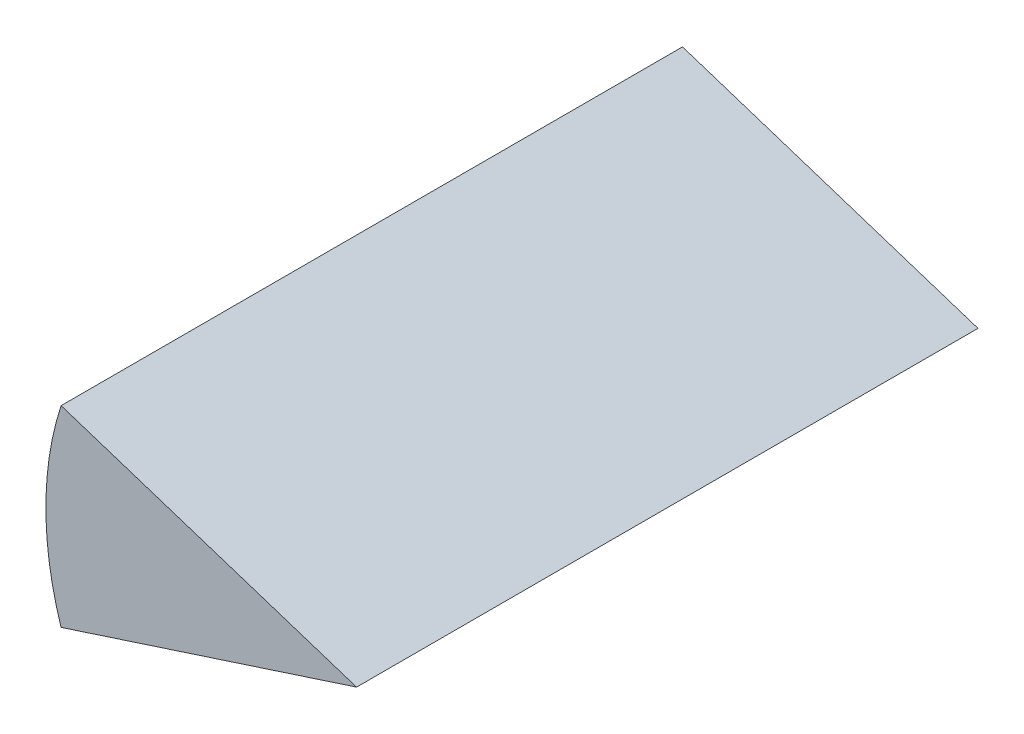
ISO-10303-21;
HEADER;
FILE_DESCRIPTION(('STEP AP214'),'2;1');
FILE_NAME('part.step','',(''),(''),'','','');
FILE_SCHEMA(('AUTOMOTIVE_DESIGN { 1 0 10303 214 1 1 1 1 }'));
ENDSEC;
DATA;
#1=APPLICATION_CONTEXT('core data for automotive mechanical design processes');
#2=APPLICATION_PROTOCOL_DEFINITION('international standard','automotive_design',2000,#1);
#3=PRODUCT_CONTEXT('',#1,'mechanical');
#4=PRODUCT('Part','Part','',(#3));
#5=PRODUCT_RELATED_PRODUCT_CATEGORY('part','',(#4));
#6=PRODUCT_DEFINITION_FORMATION('','',#4);
#7=PRODUCT_DEFINITION_CONTEXT('part definition',#1,'design');
#8=PRODUCT_DEFINITION('design','',#6,#7);
#9=PRODUCT_DEFINITION_SHAPE('','',#8);
#10=(LENGTH_UNIT() NAMED_UNIT(*) SI_UNIT(.MILLI.,.METRE.));
#11=(NAMED_UNIT(*) PLANE_ANGLE_UNIT() SI_UNIT($,.RADIAN.));
#12=(NAMED_UNIT(*) SI_UNIT($,.STERADIAN.) SOLID_ANGLE_UNIT());
#13=UNCERTAINTY_MEASURE_WITH_UNIT(LENGTH_MEASURE(1.E-05),#10,'distance_accuracy_value','');
#14=(GEOMETRIC_REPRESENTATION_CONTEXT(3) GLOBAL_UNCERTAINTY_ASSIGNED_CONTEXT((#13)) GLOBAL_UNIT_ASSIGNED_CONTEXT((#10,
#11,#12)) REPRESENTATION_CONTEXT('',''));
#15=CARTESIAN_POINT('',(0.,0.,0.));
#16=DIRECTION('',(0.,0.,1.));
#17=DIRECTION('',(1.,0.,0.));
#18=AXIS2_PLACEMENT_3D('',#15,#16,#17);
#19=CARTESIAN_POINT('',(0.,0.,50.));
#20=DIRECTION('',(-0.309016994374945,0.951056516295154,0.));
#21=DIRECTION('',(-0.951056516295155,-0.309016994374945,0.));
#22=AXIS2_PLACEMENT_3D('',#19,#20,#21);
#23=PLANE('',#22);
#24=DIRECTION('',(0.951056516295154,0.309016994374945,0.));
#25=VECTOR('',#24,1.);
#26=CARTESIAN_POINT('',(0.,0.,0.));
#27=LINE('',#26,#25);
#28=CARTESIAN_POINT('',(-23.7764129073789,-7.72542485937362,0.));
#29=VERTEX_POINT('',#28);
#30=CARTESIAN_POINT('',(0.,0.,0.));
#31=VERTEX_POINT('',#30);
#32=EDGE_CURVE('E80',#29,#31,#27,.T.);
#33=ORIENTED_EDGE('',*,*,#32,.T.);
#34=DIRECTION('',(0.,0.,-1.));
#35=VECTOR('',#34,1.);
#36=CARTESIAN_POINT('',(0.,0.,50.));
#37=LINE('',#36,#35);
#38=CARTESIAN_POINT('',(0.,0.,50.));
#39=VERTEX_POINT('',#38);
#40=EDGE_CURVE('E11',#39,#31,#37,.T.);
#41=ORIENTED_EDGE('',*,*,#40,.F.);
#42=DIRECTION('',(0.951056516295154,0.309016994374945,0.));
#43=VECTOR('',#42,1.);
#44=CARTESIAN_POINT('',(0.,0.,50.));
#45=LINE('',#44,#43);
#46=CARTESIAN_POINT('',(-23.7764129073789,-7.72542485937362,50.));
#47=VERTEX_POINT('',#46);
#48=EDGE_CURVE('E73',#47,#39,#45,.T.);
#49=ORIENTED_EDGE('',*,*,#48,.F.);
#50=DIRECTION('',(0.,0.,-1.));
#51=VECTOR('',#50,1.);
#52=CARTESIAN_POINT('',(-23.7764129073789,-7.72542485937362,50.));
#53=LINE('',#52,#51);
#54=EDGE_CURVE('E81',#47,#29,#53,.T.);
#55=ORIENTED_EDGE('',*,*,#54,.T.);
#56=EDGE_LOOP('',(#33,#41,#49,#55));
#57=FACE_BOUND('',#56,.T.);
#58=ADVANCED_FACE('F33',(#57),#23,.F.);
#59=CARTESIAN_POINT('',(0.,0.,50.));
#60=DIRECTION('',(-0.309016994374951,-0.951056516295152,0.));
#61=DIRECTION('',(0.951056516295152,-0.309016994374951,0.));
#62=AXIS2_PLACEMENT_3D('',#59,#60,#61);
#63=PLANE('',#62);
#64=DIRECTION('',(-0.951056516295152,0.309016994374951,0.));
#65=VECTOR('',#64,1.);
#66=CARTESIAN_POINT('',(0.,0.,0.));
#67=LINE('',#66,#65);
#68=CARTESIAN_POINT('',(-23.7764129073788,7.72542485937378,0.));
#69=VERTEX_POINT('',#68);
#70=EDGE_CURVE('E61',#31,#69,#67,.T.);
#71=ORIENTED_EDGE('',*,*,#70,.T.);
#72=DIRECTION('',(0.,0.,-1.));
#73=VECTOR('',#72,1.);
#74=CARTESIAN_POINT('',(-23.7764129073788,7.72542485937378,50.));
#75=LINE('',#74,#73);
#76=CARTESIAN_POINT('',(-23.7764129073788,7.72542485937378,50.));
#77=VERTEX_POINT('',#76);
#78=EDGE_CURVE('E41',#77,#69,#75,.T.);
#79=ORIENTED_EDGE('',*,*,#78,.F.);
#80=DIRECTION('',(-0.951056516295152,0.309016994374951,0.));
#81=VECTOR('',#80,1.);
#82=CARTESIAN_POINT('',(0.,0.,50.));
#83=LINE('',#82,#81);
#84=EDGE_CURVE('E69',#39,#77,#83,.T.);
#85=ORIENTED_EDGE('',*,*,#84,.F.);
#86=ORIENTED_EDGE('',*,*,#40,.T.);
#87=EDGE_LOOP('',(#71,#79,#85,#86));
#88=FACE_BOUND('',#87,.T.);
#89=ADVANCED_FACE('F70',(#88),#63,.F.);
#90=CARTESIAN_POINT('',(0.,0.,50.));
#91=DIRECTION('',(0.,0.,-1.));
#92=DIRECTION('',(-1.,0.,0.));
#93=AXIS2_PLACEMENT_3D('',#90,#91,#92);
#94=CYLINDRICAL_SURFACE('',#93,25.);
#95=CARTESIAN_POINT('',(0.,0.,0.));
#96=DIRECTION('',(0.,0.,1.));
#97=DIRECTION('',(1.,0.,0.));
#98=AXIS2_PLACEMENT_3D('',#95,#96,#97);
#99=CIRCLE('',#98,25.);
#100=EDGE_CURVE('E66',#69,#29,#99,.T.);
#101=ORIENTED_EDGE('',*,*,#100,.T.);
#102=ORIENTED_EDGE('',*,*,#54,.F.);
#103=CARTESIAN_POINT('',(0.,0.,50.));
#104=DIRECTION('',(0.,0.,1.));
#105=DIRECTION('',(1.,0.,0.));
#106=AXIS2_PLACEMENT_3D('',#103,#104,#105);
#107=CIRCLE('',#106,25.);
#108=EDGE_CURVE('E49',#77,#47,#107,.T.);
#109=ORIENTED_EDGE('',*,*,#108,.F.);
#110=ORIENTED_EDGE('',*,*,#78,.T.);
#111=EDGE_LOOP('',(#101,#102,#109,#110));
#112=FACE_BOUND('',#111,.T.);
#113=ADVANCED_FACE('F92',(#112),#94,.T.);
#114=CARTESIAN_POINT('',(0.,0.,50.));
#115=DIRECTION('',(0.,0.,1.));
#116=DIRECTION('',(1.,0.,0.));
#117=AXIS2_PLACEMENT_3D('',#114,#115,#116);
#118=PLANE('',#117);
#119=ORIENTED_EDGE('',*,*,#48,.T.);
#120=ORIENTED_EDGE('',*,*,#84,.T.);
#121=ORIENTED_EDGE('',*,*,#108,.T.);
#122=EDGE_LOOP('',(#119,#120,#121));
#123=FACE_BOUND('',#122,.T.);
#124=ADVANCED_FACE('F76',(#123),#118,.T.);
#125=CARTESIAN_POINT('',(0.,0.,0.));
#126=DIRECTION('',(0.,0.,1.));
#127=DIRECTION('',(1.,0.,0.));
#128=AXIS2_PLACEMENT_3D('',#125,#126,#127);
#129=PLANE('',#128);
#130=CARTESIAN_POINT('',(-18.9669058470814,0.102882593021989,0.));
#131=DIRECTION('',(0.,0.,-1.));
#132=DIRECTION('',(-1.,0.,0.));
#133=AXIS2_PLACEMENT_3D('',#130,#131,#132);
#134=CIRCLE('',#133,5.);
#135=CARTESIAN_POINT('',(-23.9669058470814,0.102882593021989,0.));
#136=VERTEX_POINT('',#135);
#137=EDGE_CURVE('E87',#136,#136,#134,.T.);
#138=ORIENTED_EDGE('',*,*,#137,.F.);
#139=EDGE_LOOP('',(#138));
#140=FACE_BOUND('',#139,.T.);
#141=ORIENTED_EDGE('',*,*,#32,.F.);
#142=ORIENTED_EDGE('',*,*,#100,.F.);
#143=ORIENTED_EDGE('',*,*,#70,.F.);
#144=EDGE_LOOP('',(#141,#142,#143));
#145=FACE_BOUND('',#144,.T.);
#146=ADVANCED_FACE('F93',(#140,#145),#129,.F.);
#147=CARTESIAN_POINT('',(-18.9669058470814,0.102882593021989,10.));
#148=DIRECTION('',(0.,0.,-1.));
#149=DIRECTION('',(-1.,0.,0.));
#150=AXIS2_PLACEMENT_3D('',#147,#148,#149);
#151=CYLINDRICAL_SURFACE('',#150,5.);
#152=CARTESIAN_POINT('',(-18.9669058470814,0.102882593021989,10.));
#153=DIRECTION('',(0.,0.,-1.));
#154=DIRECTION('',(-1.,0.,0.));
#155=AXIS2_PLACEMENT_3D('',#152,#153,#154);
#156=CIRCLE('',#155,5.);
#157=CARTESIAN_POINT('',(-23.9669058470814,0.102882593021989,10.));
#158=VERTEX_POINT('',#157);
#159=EDGE_CURVE('E83',#158,#158,#156,.T.);
#160=ORIENTED_EDGE('',*,*,#159,.F.);
#161=EDGE_LOOP('',(#160));
#162=FACE_BOUND('',#161,.T.);
#163=ORIENTED_EDGE('',*,*,#137,.T.);
#164=EDGE_LOOP('',(#163));
#165=FACE_BOUND('',#164,.T.);
#166=ADVANCED_FACE('F95',(#162,#165),#151,.F.);
#167=CARTESIAN_POINT('',(-18.9669058470814,0.102882593021989,10.));
#168=DIRECTION('',(0.,0.,-1.));
#169=DIRECTION('',(-1.,0.,0.));
#170=AXIS2_PLACEMENT_3D('',#167,#168,#169);
#171=PLANE('',#170);
#172=ORIENTED_EDGE('',*,*,#159,.T.);
#173=EDGE_LOOP('',(#172));
#174=FACE_BOUND('',#173,.T.);
#175=ADVANCED_FACE('F102',(#174),#171,.T.);
#176=CLOSED_SHELL('',(#58,#89,#113,#124,#146,#166,#175));
#177=MANIFOLD_SOLID_BREP('B2',#176);
#178=ADVANCED_BREP_SHAPE_REPRESENTATION('',(#18,#177),#14);
#179=SHAPE_DEFINITION_REPRESENTATION(#9,#178);
ENDSEC;
END-ISO-10303-21;
